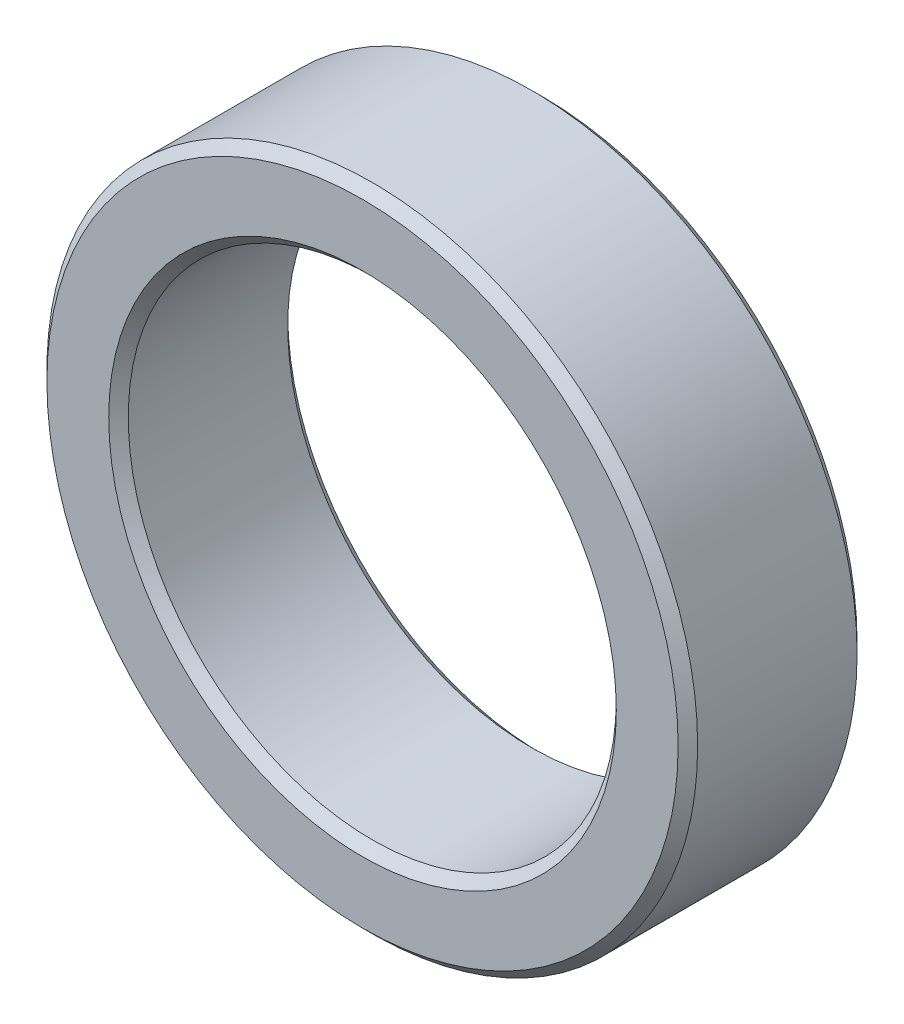
ISO-10303-21;
HEADER;
FILE_DESCRIPTION(('STEP AP214'),'2;1');
FILE_NAME('part.step','',(''),(''),'','','');
FILE_SCHEMA(('AUTOMOTIVE_DESIGN { 1 0 10303 214 1 1 1 1 }'));
ENDSEC;
DATA;
#1=APPLICATION_CONTEXT('core data for automotive mechanical design processes');
#2=APPLICATION_PROTOCOL_DEFINITION('international standard','automotive_design',2000,#1);
#3=PRODUCT_CONTEXT('',#1,'mechanical');
#4=PRODUCT('Part','Part','',(#3));
#5=PRODUCT_RELATED_PRODUCT_CATEGORY('part','',(#4));
#6=PRODUCT_DEFINITION_FORMATION('','',#4);
#7=PRODUCT_DEFINITION_CONTEXT('part definition',#1,'design');
#8=PRODUCT_DEFINITION('design','',#6,#7);
#9=PRODUCT_DEFINITION_SHAPE('','',#8);
#10=(LENGTH_UNIT() NAMED_UNIT(*) SI_UNIT(.MILLI.,.METRE.));
#11=(NAMED_UNIT(*) PLANE_ANGLE_UNIT() SI_UNIT($,.RADIAN.));
#12=(NAMED_UNIT(*) SI_UNIT($,.STERADIAN.) SOLID_ANGLE_UNIT());
#13=UNCERTAINTY_MEASURE_WITH_UNIT(LENGTH_MEASURE(1.E-05),#10,'distance_accuracy_value','');
#14=(GEOMETRIC_REPRESENTATION_CONTEXT(3) GLOBAL_UNCERTAINTY_ASSIGNED_CONTEXT((#13)) GLOBAL_UNIT_ASSIGNED_CONTEXT((#10,
#11,#12)) REPRESENTATION_CONTEXT('',''));
#15=CARTESIAN_POINT('',(0.,0.,0.));
#16=DIRECTION('',(0.,0.,1.));
#17=DIRECTION('',(1.,0.,0.));
#18=AXIS2_PLACEMENT_3D('',#15,#16,#17);
#19=CARTESIAN_POINT('',(0.,9.7,2.));
#20=DIRECTION('',(0.,0.,-1.));
#21=DIRECTION('',(-1.,0.,0.));
#22=AXIS2_PLACEMENT_3D('',#19,#20,#21);
#23=PLANE('',#22);
#24=CARTESIAN_POINT('',(0.,0.,2.));
#25=DIRECTION('',(0.,0.,1.));
#26=DIRECTION('',(1.,0.,0.));
#27=AXIS2_PLACEMENT_3D('',#24,#25,#26);
#28=CIRCLE('',#27,7.8);
#29=CARTESIAN_POINT('',(7.8,0.,2.));
#30=VERTEX_POINT('',#29);
#31=EDGE_CURVE('E10',#30,#30,#28,.T.);
#32=ORIENTED_EDGE('',*,*,#31,.F.);
#33=EDGE_LOOP('',(#32));
#34=FACE_BOUND('',#33,.T.);
#35=CARTESIAN_POINT('',(0.,0.,2.));
#36=DIRECTION('',(0.,0.,1.));
#37=DIRECTION('',(1.,0.,0.));
#38=AXIS2_PLACEMENT_3D('',#35,#36,#37);
#39=CIRCLE('',#38,9.7);
#40=CARTESIAN_POINT('',(9.7,0.,2.));
#41=VERTEX_POINT('',#40);
#42=EDGE_CURVE('E376',#41,#41,#39,.T.);
#43=ORIENTED_EDGE('',*,*,#42,.T.);
#44=EDGE_LOOP('',(#43));
#45=FACE_BOUND('',#44,.T.);
#46=ADVANCED_FACE('F348',(#34,#45),#23,.F.);
#47=CARTESIAN_POINT('',(0.,0.,2.));
#48=DIRECTION('',(0.,0.,1.));
#49=DIRECTION('',(1.,0.,0.));
#50=AXIS2_PLACEMENT_3D('',#47,#48,#49);
#51=CONICAL_SURFACE('',#50,7.8,0.785398163397445);
#52=CARTESIAN_POINT('',(0.,0.,1.7));
#53=DIRECTION('',(0.,0.,1.));
#54=DIRECTION('',(1.,0.,0.));
#55=AXIS2_PLACEMENT_3D('',#52,#53,#54);
#56=CIRCLE('',#55,7.5);
#57=CARTESIAN_POINT('',(7.5,0.,1.7));
#58=VERTEX_POINT('',#57);
#59=EDGE_CURVE('E354',#58,#58,#56,.T.);
#60=ORIENTED_EDGE('',*,*,#59,.F.);
#61=EDGE_LOOP('',(#60));
#62=FACE_BOUND('',#61,.T.);
#63=ORIENTED_EDGE('',*,*,#31,.T.);
#64=EDGE_LOOP('',(#63));
#65=FACE_BOUND('',#64,.T.);
#66=ADVANCED_FACE('F413',(#62,#65),#51,.F.);
#67=CARTESIAN_POINT('',(0.,0.,10.3632));
#68=DIRECTION('',(0.,0.,1.));
#69=DIRECTION('',(1.,0.,0.));
#70=AXIS2_PLACEMENT_3D('',#67,#68,#69);
#71=CYLINDRICAL_SURFACE('',#70,7.5);
#72=CARTESIAN_POINT('',(0.,0.,-3.2));
#73=DIRECTION('',(0.,0.,1.));
#74=DIRECTION('',(1.,0.,0.));
#75=AXIS2_PLACEMENT_3D('',#72,#73,#74);
#76=CIRCLE('',#75,7.5);
#77=CARTESIAN_POINT('',(7.5,0.,-3.2));
#78=VERTEX_POINT('',#77);
#79=EDGE_CURVE('E358',#78,#78,#76,.T.);
#80=ORIENTED_EDGE('',*,*,#79,.F.);
#81=EDGE_LOOP('',(#80));
#82=FACE_BOUND('',#81,.T.);
#83=ORIENTED_EDGE('',*,*,#59,.T.);
#84=EDGE_LOOP('',(#83));
#85=FACE_BOUND('',#84,.T.);
#86=ADVANCED_FACE('F408',(#82,#85),#71,.F.);
#87=CARTESIAN_POINT('',(0.,0.,-3.2));
#88=DIRECTION('',(0.,0.,-1.));
#89=DIRECTION('',(-1.,0.,0.));
#90=AXIS2_PLACEMENT_3D('',#87,#88,#89);
#91=CONICAL_SURFACE('',#90,7.5,0.785398163397445);
#92=CARTESIAN_POINT('',(0.,0.,-3.5));
#93=DIRECTION('',(0.,0.,1.));
#94=DIRECTION('',(1.,0.,0.));
#95=AXIS2_PLACEMENT_3D('',#92,#93,#94);
#96=CIRCLE('',#95,7.8);
#97=CARTESIAN_POINT('',(7.8,0.,-3.5));
#98=VERTEX_POINT('',#97);
#99=EDGE_CURVE('E362',#98,#98,#96,.T.);
#100=ORIENTED_EDGE('',*,*,#99,.F.);
#101=EDGE_LOOP('',(#100));
#102=FACE_BOUND('',#101,.T.);
#103=ORIENTED_EDGE('',*,*,#79,.T.);
#104=EDGE_LOOP('',(#103));
#105=FACE_BOUND('',#104,.T.);
#106=ADVANCED_FACE('F402',(#102,#105),#91,.F.);
#107=CARTESIAN_POINT('',(0.,9.7,-3.5));
#108=DIRECTION('',(0.,0.,1.));
#109=DIRECTION('',(1.,0.,0.));
#110=AXIS2_PLACEMENT_3D('',#107,#108,#109);
#111=PLANE('',#110);
#112=CARTESIAN_POINT('',(0.,0.,-3.5));
#113=DIRECTION('',(0.,0.,1.));
#114=DIRECTION('',(1.,0.,0.));
#115=AXIS2_PLACEMENT_3D('',#112,#113,#114);
#116=CIRCLE('',#115,9.7);
#117=CARTESIAN_POINT('',(9.7,0.,-3.5));
#118=VERTEX_POINT('',#117);
#119=EDGE_CURVE('E367',#118,#118,#116,.T.);
#120=ORIENTED_EDGE('',*,*,#119,.F.);
#121=EDGE_LOOP('',(#120));
#122=FACE_BOUND('',#121,.T.);
#123=ORIENTED_EDGE('',*,*,#99,.T.);
#124=EDGE_LOOP('',(#123));
#125=FACE_BOUND('',#124,.T.);
#126=ADVANCED_FACE('F396',(#122,#125),#111,.F.);
#127=CARTESIAN_POINT('',(0.,0.,-3.5));
#128=DIRECTION('',(0.,0.,1.));
#129=DIRECTION('',(1.,0.,0.));
#130=AXIS2_PLACEMENT_3D('',#127,#128,#129);
#131=CONICAL_SURFACE('',#130,9.7,0.785398163397445);
#132=CARTESIAN_POINT('',(0.,0.,-3.2));
#133=DIRECTION('',(0.,0.,1.));
#134=DIRECTION('',(1.,0.,0.));
#135=AXIS2_PLACEMENT_3D('',#132,#133,#134);
#136=CIRCLE('',#135,10.);
#137=CARTESIAN_POINT('',(10.,0.,-3.2));
#138=VERTEX_POINT('',#137);
#139=EDGE_CURVE('E370',#138,#138,#136,.T.);
#140=ORIENTED_EDGE('',*,*,#139,.F.);
#141=EDGE_LOOP('',(#140));
#142=FACE_BOUND('',#141,.T.);
#143=ORIENTED_EDGE('',*,*,#119,.T.);
#144=EDGE_LOOP('',(#143));
#145=FACE_BOUND('',#144,.T.);
#146=ADVANCED_FACE('F390',(#142,#145),#131,.T.);
#147=CARTESIAN_POINT('',(0.,0.,10.3632));
#148=DIRECTION('',(0.,0.,1.));
#149=DIRECTION('',(1.,0.,0.));
#150=AXIS2_PLACEMENT_3D('',#147,#148,#149);
#151=CYLINDRICAL_SURFACE('',#150,10.);
#152=CARTESIAN_POINT('',(0.,0.,1.7));
#153=DIRECTION('',(0.,0.,1.));
#154=DIRECTION('',(1.,0.,0.));
#155=AXIS2_PLACEMENT_3D('',#152,#153,#154);
#156=CIRCLE('',#155,10.);
#157=CARTESIAN_POINT('',(10.,0.,1.7));
#158=VERTEX_POINT('',#157);
#159=EDGE_CURVE('E373',#158,#158,#156,.T.);
#160=ORIENTED_EDGE('',*,*,#159,.F.);
#161=EDGE_LOOP('',(#160));
#162=FACE_BOUND('',#161,.T.);
#163=ORIENTED_EDGE('',*,*,#139,.T.);
#164=EDGE_LOOP('',(#163));
#165=FACE_BOUND('',#164,.T.);
#166=ADVANCED_FACE('F384',(#162,#165),#151,.T.);
#167=CARTESIAN_POINT('',(0.,0.,1.7));
#168=DIRECTION('',(0.,0.,-1.));
#169=DIRECTION('',(-1.,0.,0.));
#170=AXIS2_PLACEMENT_3D('',#167,#168,#169);
#171=CONICAL_SURFACE('',#170,10.,0.785398163397445);
#172=ORIENTED_EDGE('',*,*,#42,.F.);
#173=EDGE_LOOP('',(#172));
#174=FACE_BOUND('',#173,.T.);
#175=ORIENTED_EDGE('',*,*,#159,.T.);
#176=EDGE_LOOP('',(#175));
#177=FACE_BOUND('',#176,.T.);
#178=ADVANCED_FACE('F381',(#174,#177),#171,.T.);
#179=CLOSED_SHELL('',(#46,#66,#86,#106,#126,#146,#166,#178));
#180=MANIFOLD_SOLID_BREP('B2',#179);
#181=ADVANCED_BREP_SHAPE_REPRESENTATION('',(#18,#180),#14);
#182=SHAPE_DEFINITION_REPRESENTATION(#9,#181);
ENDSEC;
END-ISO-10303-21;
